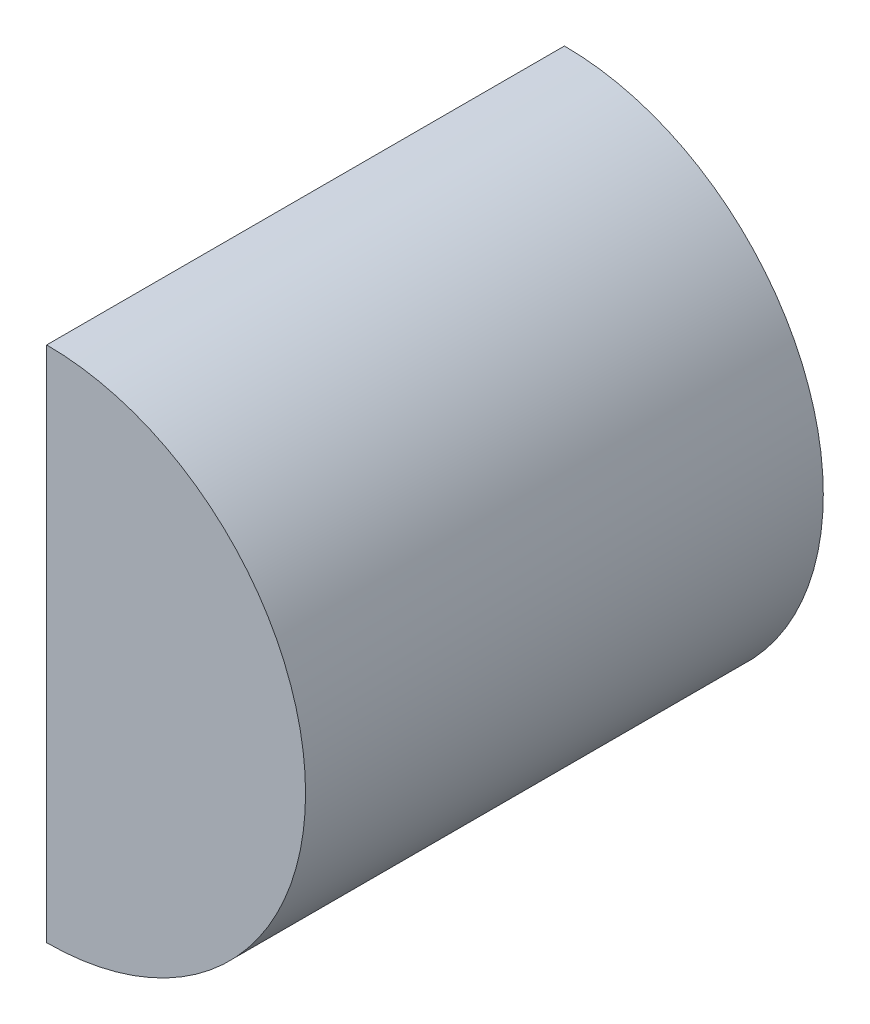
ISO-10303-21;
HEADER;
FILE_DESCRIPTION(('STEP AP214'),'2;1');
FILE_NAME('part.step','',(''),(''),'','','');
FILE_SCHEMA(('AUTOMOTIVE_DESIGN { 1 0 10303 214 1 1 1 1 }'));
ENDSEC;
DATA;
#1=APPLICATION_CONTEXT('core data for automotive mechanical design processes');
#2=APPLICATION_PROTOCOL_DEFINITION('international standard','automotive_design',2000,#1);
#3=PRODUCT_CONTEXT('',#1,'mechanical');
#4=PRODUCT('Part','Part','',(#3));
#5=PRODUCT_RELATED_PRODUCT_CATEGORY('part','',(#4));
#6=PRODUCT_DEFINITION_FORMATION('','',#4);
#7=PRODUCT_DEFINITION_CONTEXT('part definition',#1,'design');
#8=PRODUCT_DEFINITION('design','',#6,#7);
#9=PRODUCT_DEFINITION_SHAPE('','',#8);
#10=(LENGTH_UNIT() NAMED_UNIT(*) SI_UNIT(.MILLI.,.METRE.));
#11=(NAMED_UNIT(*) PLANE_ANGLE_UNIT() SI_UNIT($,.RADIAN.));
#12=(NAMED_UNIT(*) SI_UNIT($,.STERADIAN.) SOLID_ANGLE_UNIT());
#13=UNCERTAINTY_MEASURE_WITH_UNIT(LENGTH_MEASURE(1.E-05),#10,'distance_accuracy_value','');
#14=(GEOMETRIC_REPRESENTATION_CONTEXT(3) GLOBAL_UNCERTAINTY_ASSIGNED_CONTEXT((#13)) GLOBAL_UNIT_ASSIGNED_CONTEXT((#10,
#11,#12)) REPRESENTATION_CONTEXT('',''));
#15=CARTESIAN_POINT('',(0.,0.,0.));
#16=DIRECTION('',(0.,0.,1.));
#17=DIRECTION('',(1.,0.,0.));
#18=AXIS2_PLACEMENT_3D('',#15,#16,#17);
#19=CARTESIAN_POINT('',(0.,0.,50.));
#20=DIRECTION('',(0.,0.,-1.));
#21=DIRECTION('',(-1.,0.,0.));
#22=AXIS2_PLACEMENT_3D('',#19,#20,#21);
#23=CYLINDRICAL_SURFACE('',#22,25.);
#24=CARTESIAN_POINT('',(0.,0.,0.));
#25=DIRECTION('',(0.,0.,1.));
#26=DIRECTION('',(1.,0.,0.));
#27=AXIS2_PLACEMENT_3D('',#24,#25,#26);
#28=CIRCLE('',#27,25.);
#29=CARTESIAN_POINT('',(0.,-25.,0.));
#30=VERTEX_POINT('',#29);
#31=CARTESIAN_POINT('',(0.,25.,0.));
#32=VERTEX_POINT('',#31);
#33=EDGE_CURVE('E64',#30,#32,#28,.T.);
#34=ORIENTED_EDGE('',*,*,#33,.T.);
#35=DIRECTION('',(0.,0.,-1.));
#36=VECTOR('',#35,1.);
#37=CARTESIAN_POINT('',(0.,25.,50.));
#38=LINE('',#37,#36);
#39=CARTESIAN_POINT('',(0.,25.,50.));
#40=VERTEX_POINT('',#39);
#41=EDGE_CURVE('E11',#40,#32,#38,.T.);
#42=ORIENTED_EDGE('',*,*,#41,.F.);
#43=CARTESIAN_POINT('',(0.,0.,50.));
#44=DIRECTION('',(0.,0.,1.));
#45=DIRECTION('',(1.,0.,0.));
#46=AXIS2_PLACEMENT_3D('',#43,#44,#45);
#47=CIRCLE('',#46,25.);
#48=CARTESIAN_POINT('',(0.,-25.,50.));
#49=VERTEX_POINT('',#48);
#50=EDGE_CURVE('E63',#49,#40,#47,.T.);
#51=ORIENTED_EDGE('',*,*,#50,.F.);
#52=DIRECTION('',(0.,0.,-1.));
#53=VECTOR('',#52,1.);
#54=CARTESIAN_POINT('',(0.,-25.,50.));
#55=LINE('',#54,#53);
#56=EDGE_CURVE('E41',#49,#30,#55,.T.);
#57=ORIENTED_EDGE('',*,*,#56,.T.);
#58=EDGE_LOOP('',(#34,#42,#51,#57));
#59=FACE_BOUND('',#58,.T.);
#60=ADVANCED_FACE('F33',(#59),#23,.T.);
#61=CARTESIAN_POINT('',(0.,25.,50.));
#62=DIRECTION('',(1.,0.,0.));
#63=DIRECTION('',(0.,0.,-1.));
#64=AXIS2_PLACEMENT_3D('',#61,#62,#63);
#65=PLANE('',#64);
#66=DIRECTION('',(0.,-1.,0.));
#67=VECTOR('',#66,1.);
#68=CARTESIAN_POINT('',(0.,25.,0.));
#69=LINE('',#68,#67);
#70=EDGE_CURVE('E56',#32,#30,#69,.T.);
#71=ORIENTED_EDGE('',*,*,#70,.T.);
#72=ORIENTED_EDGE('',*,*,#56,.F.);
#73=DIRECTION('',(0.,-1.,0.));
#74=VECTOR('',#73,1.);
#75=CARTESIAN_POINT('',(0.,25.,50.));
#76=LINE('',#75,#74);
#77=EDGE_CURVE('E48',#40,#49,#76,.T.);
#78=ORIENTED_EDGE('',*,*,#77,.F.);
#79=ORIENTED_EDGE('',*,*,#41,.T.);
#80=EDGE_LOOP('',(#71,#72,#78,#79));
#81=FACE_BOUND('',#80,.T.);
#82=ADVANCED_FACE('F59',(#81),#65,.F.);
#83=CARTESIAN_POINT('',(0.,0.,50.));
#84=DIRECTION('',(0.,0.,1.));
#85=DIRECTION('',(1.,0.,0.));
#86=AXIS2_PLACEMENT_3D('',#83,#84,#85);
#87=PLANE('',#86);
#88=ORIENTED_EDGE('',*,*,#50,.T.);
#89=ORIENTED_EDGE('',*,*,#77,.T.);
#90=EDGE_LOOP('',(#88,#89));
#91=FACE_BOUND('',#90,.T.);
#92=ADVANCED_FACE('F82',(#91),#87,.T.);
#93=CARTESIAN_POINT('',(0.,0.,0.));
#94=DIRECTION('',(0.,0.,1.));
#95=DIRECTION('',(1.,0.,0.));
#96=AXIS2_PLACEMENT_3D('',#93,#94,#95);
#97=PLANE('',#96);
#98=CARTESIAN_POINT('',(10.550443682943,0.,0.));
#99=DIRECTION('',(0.,0.,-1.));
#100=DIRECTION('',(-1.,0.,0.));
#101=AXIS2_PLACEMENT_3D('',#98,#99,#100);
#102=CIRCLE('',#101,5.);
#103=CARTESIAN_POINT('',(5.55044368294296,0.,0.));
#104=VERTEX_POINT('',#103);
#105=EDGE_CURVE('E71',#104,#104,#102,.T.);
#106=ORIENTED_EDGE('',*,*,#105,.F.);
#107=EDGE_LOOP('',(#106));
#108=FACE_BOUND('',#107,.T.);
#109=ORIENTED_EDGE('',*,*,#33,.F.);
#110=ORIENTED_EDGE('',*,*,#70,.F.);
#111=EDGE_LOOP('',(#109,#110));
#112=FACE_BOUND('',#111,.T.);
#113=ADVANCED_FACE('F67',(#108,#112),#97,.F.);
#114=CARTESIAN_POINT('',(10.550443682943,0.,10.));
#115=DIRECTION('',(0.,0.,-1.));
#116=DIRECTION('',(-1.,0.,0.));
#117=AXIS2_PLACEMENT_3D('',#114,#115,#116);
#118=CYLINDRICAL_SURFACE('',#117,5.);
#119=CARTESIAN_POINT('',(10.550443682943,0.,10.));
#120=DIRECTION('',(0.,0.,-1.));
#121=DIRECTION('',(-1.,0.,0.));
#122=AXIS2_PLACEMENT_3D('',#119,#120,#121);
#123=CIRCLE('',#122,5.);
#124=CARTESIAN_POINT('',(5.55044368294296,0.,10.));
#125=VERTEX_POINT('',#124);
#126=EDGE_CURVE('E68',#125,#125,#123,.T.);
#127=ORIENTED_EDGE('',*,*,#126,.F.);
#128=EDGE_LOOP('',(#127));
#129=FACE_BOUND('',#128,.T.);
#130=ORIENTED_EDGE('',*,*,#105,.T.);
#131=EDGE_LOOP('',(#130));
#132=FACE_BOUND('',#131,.T.);
#133=ADVANCED_FACE('F79',(#129,#132),#118,.F.);
#134=CARTESIAN_POINT('',(10.550443682943,0.,10.));
#135=DIRECTION('',(0.,0.,-1.));
#136=DIRECTION('',(-1.,0.,0.));
#137=AXIS2_PLACEMENT_3D('',#134,#135,#136);
#138=PLANE('',#137);
#139=ORIENTED_EDGE('',*,*,#126,.T.);
#140=EDGE_LOOP('',(#139));
#141=FACE_BOUND('',#140,.T.);
#142=ADVANCED_FACE('F88',(#141),#138,.T.);
#143=CLOSED_SHELL('',(#60,#82,#92,#113,#133,#142));
#144=MANIFOLD_SOLID_BREP('B2',#143);
#145=ADVANCED_BREP_SHAPE_REPRESENTATION('',(#18,#144),#14);
#146=SHAPE_DEFINITION_REPRESENTATION(#9,#145);
ENDSEC;
END-ISO-10303-21;
